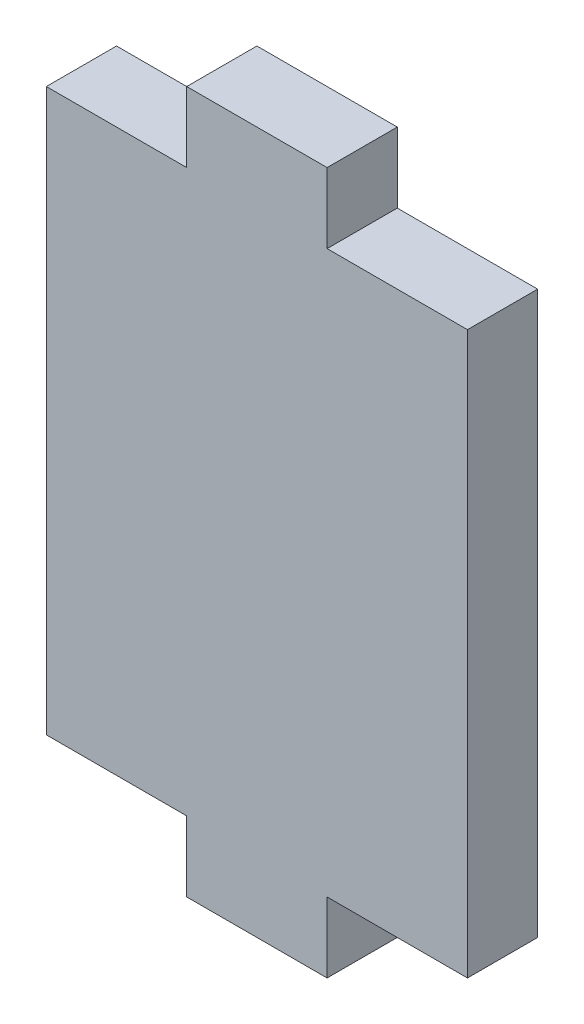
ISO-10303-21;
HEADER;
FILE_DESCRIPTION(('STEP AP214'),'2;1');
FILE_NAME('part.step','',(''),(''),'','','');
FILE_SCHEMA(('AUTOMOTIVE_DESIGN { 1 0 10303 214 1 1 1 1 }'));
ENDSEC;
DATA;
#1=APPLICATION_CONTEXT('core data for automotive mechanical design processes');
#2=APPLICATION_PROTOCOL_DEFINITION('international standard','automotive_design',2000,#1);
#3=PRODUCT_CONTEXT('',#1,'mechanical');
#4=PRODUCT('Part','Part','',(#3));
#5=PRODUCT_RELATED_PRODUCT_CATEGORY('part','',(#4));
#6=PRODUCT_DEFINITION_FORMATION('','',#4);
#7=PRODUCT_DEFINITION_CONTEXT('part definition',#1,'design');
#8=PRODUCT_DEFINITION('design','',#6,#7);
#9=PRODUCT_DEFINITION_SHAPE('','',#8);
#10=(LENGTH_UNIT() NAMED_UNIT(*) SI_UNIT(.MILLI.,.METRE.));
#11=(NAMED_UNIT(*) PLANE_ANGLE_UNIT() SI_UNIT($,.RADIAN.));
#12=(NAMED_UNIT(*) SI_UNIT($,.STERADIAN.) SOLID_ANGLE_UNIT());
#13=UNCERTAINTY_MEASURE_WITH_UNIT(LENGTH_MEASURE(1.E-05),#10,'distance_accuracy_value','');
#14=(GEOMETRIC_REPRESENTATION_CONTEXT(3) GLOBAL_UNCERTAINTY_ASSIGNED_CONTEXT((#13)) GLOBAL_UNIT_ASSIGNED_CONTEXT((#10,
#11,#12)) REPRESENTATION_CONTEXT('',''));
#15=CARTESIAN_POINT('',(0.,0.,0.));
#16=DIRECTION('',(0.,0.,1.));
#17=DIRECTION('',(1.,0.,0.));
#18=AXIS2_PLACEMENT_3D('',#15,#16,#17);
#19=CARTESIAN_POINT('',(-15.,-20.,5.));
#20=DIRECTION('',(-1.,0.,0.));
#21=DIRECTION('',(0.,0.,1.));
#22=AXIS2_PLACEMENT_3D('',#19,#20,#21);
#23=PLANE('',#22);
#24=DIRECTION('',(0.,1.,0.));
#25=VECTOR('',#24,1.);
#26=CARTESIAN_POINT('',(-15.,-20.,0.));
#27=LINE('',#26,#25);
#28=CARTESIAN_POINT('',(-15.,-20.,0.));
#29=VERTEX_POINT('',#28);
#30=CARTESIAN_POINT('',(-15.,20.,0.));
#31=VERTEX_POINT('',#30);
#32=EDGE_CURVE('E160',#29,#31,#27,.T.);
#33=ORIENTED_EDGE('',*,*,#32,.F.);
#34=DIRECTION('',(0.,0.,-1.));
#35=VECTOR('',#34,1.);
#36=CARTESIAN_POINT('',(-15.,-20.,5.));
#37=LINE('',#36,#35);
#38=CARTESIAN_POINT('',(-15.,-20.,5.));
#39=VERTEX_POINT('',#38);
#40=EDGE_CURVE('E11',#39,#29,#37,.T.);
#41=ORIENTED_EDGE('',*,*,#40,.F.);
#42=DIRECTION('',(0.,1.,0.));
#43=VECTOR('',#42,1.);
#44=CARTESIAN_POINT('',(-15.,-20.,5.));
#45=LINE('',#44,#43);
#46=CARTESIAN_POINT('',(-15.,20.,5.));
#47=VERTEX_POINT('',#46);
#48=EDGE_CURVE('E189',#39,#47,#45,.T.);
#49=ORIENTED_EDGE('',*,*,#48,.T.);
#50=DIRECTION('',(0.,0.,-1.));
#51=VECTOR('',#50,1.);
#52=CARTESIAN_POINT('',(-15.,20.,5.));
#53=LINE('',#52,#51);
#54=EDGE_CURVE('E40',#47,#31,#53,.T.);
#55=ORIENTED_EDGE('',*,*,#54,.T.);
#56=EDGE_LOOP('',(#33,#41,#49,#55));
#57=FACE_BOUND('',#56,.T.);
#58=ADVANCED_FACE('F37',(#57),#23,.T.);
#59=CARTESIAN_POINT('',(-15.,-20.,5.));
#60=DIRECTION('',(0.,1.,0.));
#61=DIRECTION('',(-1.,0.,0.));
#62=AXIS2_PLACEMENT_3D('',#59,#60,#61);
#63=PLANE('',#62);
#64=DIRECTION('',(1.,0.,0.));
#65=VECTOR('',#64,1.);
#66=CARTESIAN_POINT('',(-15.,-20.,0.));
#67=LINE('',#66,#65);
#68=CARTESIAN_POINT('',(-5.,-20.,0.));
#69=VERTEX_POINT('',#68);
#70=EDGE_CURVE('E94',#29,#69,#67,.T.);
#71=ORIENTED_EDGE('',*,*,#70,.T.);
#72=DIRECTION('',(0.,0.,-1.));
#73=VECTOR('',#72,1.);
#74=CARTESIAN_POINT('',(-5.,-20.,5.));
#75=LINE('',#74,#73);
#76=CARTESIAN_POINT('',(-5.,-20.,5.));
#77=VERTEX_POINT('',#76);
#78=EDGE_CURVE('E46',#77,#69,#75,.T.);
#79=ORIENTED_EDGE('',*,*,#78,.F.);
#80=DIRECTION('',(1.,0.,0.));
#81=VECTOR('',#80,1.);
#82=CARTESIAN_POINT('',(-15.,-20.,5.));
#83=LINE('',#82,#81);
#84=EDGE_CURVE('E138',#39,#77,#83,.T.);
#85=ORIENTED_EDGE('',*,*,#84,.F.);
#86=ORIENTED_EDGE('',*,*,#40,.T.);
#87=EDGE_LOOP('',(#71,#79,#85,#86));
#88=FACE_BOUND('',#87,.T.);
#89=ADVANCED_FACE('F264',(#88),#63,.F.);
#90=CARTESIAN_POINT('',(-5.,-20.,5.));
#91=DIRECTION('',(1.,0.,0.));
#92=DIRECTION('',(0.,1.,0.));
#93=AXIS2_PLACEMENT_3D('',#90,#91,#92);
#94=PLANE('',#93);
#95=DIRECTION('',(0.,-1.,0.));
#96=VECTOR('',#95,1.);
#97=CARTESIAN_POINT('',(-5.,-20.,0.));
#98=LINE('',#97,#96);
#99=CARTESIAN_POINT('',(-5.,-25.,0.));
#100=VERTEX_POINT('',#99);
#101=EDGE_CURVE('E145',#69,#100,#98,.T.);
#102=ORIENTED_EDGE('',*,*,#101,.T.);
#103=DIRECTION('',(0.,0.,-1.));
#104=VECTOR('',#103,1.);
#105=CARTESIAN_POINT('',(-5.,-25.,5.));
#106=LINE('',#105,#104);
#107=CARTESIAN_POINT('',(-5.,-25.,5.));
#108=VERTEX_POINT('',#107);
#109=EDGE_CURVE('E142',#108,#100,#106,.T.);
#110=ORIENTED_EDGE('',*,*,#109,.F.);
#111=DIRECTION('',(0.,-1.,0.));
#112=VECTOR('',#111,1.);
#113=CARTESIAN_POINT('',(-5.,-20.,5.));
#114=LINE('',#113,#112);
#115=EDGE_CURVE('E130',#77,#108,#114,.T.);
#116=ORIENTED_EDGE('',*,*,#115,.F.);
#117=ORIENTED_EDGE('',*,*,#78,.T.);
#118=EDGE_LOOP('',(#102,#110,#116,#117));
#119=FACE_BOUND('',#118,.T.);
#120=ADVANCED_FACE('F143',(#119),#94,.F.);
#121=CARTESIAN_POINT('',(-5.,-25.,5.));
#122=DIRECTION('',(0.,1.,0.));
#123=DIRECTION('',(0.,0.,1.));
#124=AXIS2_PLACEMENT_3D('',#121,#122,#123);
#125=PLANE('',#124);
#126=DIRECTION('',(1.,0.,0.));
#127=VECTOR('',#126,1.);
#128=CARTESIAN_POINT('',(-5.,-25.,0.));
#129=LINE('',#128,#127);
#130=CARTESIAN_POINT('',(5.,-25.,0.));
#131=VERTEX_POINT('',#130);
#132=EDGE_CURVE('E186',#100,#131,#129,.T.);
#133=ORIENTED_EDGE('',*,*,#132,.T.);
#134=DIRECTION('',(0.,0.,-1.));
#135=VECTOR('',#134,1.);
#136=CARTESIAN_POINT('',(5.,-25.,5.));
#137=LINE('',#136,#135);
#138=CARTESIAN_POINT('',(5.,-25.,5.));
#139=VERTEX_POINT('',#138);
#140=EDGE_CURVE('E149',#139,#131,#137,.T.);
#141=ORIENTED_EDGE('',*,*,#140,.F.);
#142=DIRECTION('',(1.,0.,0.));
#143=VECTOR('',#142,1.);
#144=CARTESIAN_POINT('',(-5.,-25.,5.));
#145=LINE('',#144,#143);
#146=EDGE_CURVE('E136',#108,#139,#145,.T.);
#147=ORIENTED_EDGE('',*,*,#146,.F.);
#148=ORIENTED_EDGE('',*,*,#109,.T.);
#149=EDGE_LOOP('',(#133,#141,#147,#148));
#150=FACE_BOUND('',#149,.T.);
#151=ADVANCED_FACE('F151',(#150),#125,.F.);
#152=CARTESIAN_POINT('',(5.,-20.,5.));
#153=DIRECTION('',(1.,0.,0.));
#154=DIRECTION('',(0.,1.,0.));
#155=AXIS2_PLACEMENT_3D('',#152,#153,#154);
#156=PLANE('',#155);
#157=DIRECTION('',(0.,-1.,0.));
#158=VECTOR('',#157,1.);
#159=CARTESIAN_POINT('',(5.,-20.,0.));
#160=LINE('',#159,#158);
#161=CARTESIAN_POINT('',(5.,-20.,0.));
#162=VERTEX_POINT('',#161);
#163=EDGE_CURVE('E183',#162,#131,#160,.T.);
#164=ORIENTED_EDGE('',*,*,#163,.F.);
#165=DIRECTION('',(0.,0.,-1.));
#166=VECTOR('',#165,1.);
#167=CARTESIAN_POINT('',(5.,-20.,5.));
#168=LINE('',#167,#166);
#169=CARTESIAN_POINT('',(5.,-20.,5.));
#170=VERTEX_POINT('',#169);
#171=EDGE_CURVE('E193',#170,#162,#168,.T.);
#172=ORIENTED_EDGE('',*,*,#171,.F.);
#173=DIRECTION('',(0.,-1.,0.));
#174=VECTOR('',#173,1.);
#175=CARTESIAN_POINT('',(5.,-20.,5.));
#176=LINE('',#175,#174);
#177=EDGE_CURVE('E153',#170,#139,#176,.T.);
#178=ORIENTED_EDGE('',*,*,#177,.T.);
#179=ORIENTED_EDGE('',*,*,#140,.T.);
#180=EDGE_LOOP('',(#164,#172,#178,#179));
#181=FACE_BOUND('',#180,.T.);
#182=ADVANCED_FACE('F214',(#181),#156,.T.);
#183=CARTESIAN_POINT('',(5.,-20.,5.));
#184=DIRECTION('',(0.,1.,0.));
#185=DIRECTION('',(-1.,0.,0.));
#186=AXIS2_PLACEMENT_3D('',#183,#184,#185);
#187=PLANE('',#186);
#188=DIRECTION('',(1.,0.,0.));
#189=VECTOR('',#188,1.);
#190=CARTESIAN_POINT('',(5.,-20.,0.));
#191=LINE('',#190,#189);
#192=CARTESIAN_POINT('',(15.,-20.,0.));
#193=VERTEX_POINT('',#192);
#194=EDGE_CURVE('E181',#162,#193,#191,.T.);
#195=ORIENTED_EDGE('',*,*,#194,.T.);
#196=DIRECTION('',(0.,0.,-1.));
#197=VECTOR('',#196,1.);
#198=CARTESIAN_POINT('',(15.,-20.,5.));
#199=LINE('',#198,#197);
#200=CARTESIAN_POINT('',(15.,-20.,5.));
#201=VERTEX_POINT('',#200);
#202=EDGE_CURVE('E195',#201,#193,#199,.T.);
#203=ORIENTED_EDGE('',*,*,#202,.F.);
#204=DIRECTION('',(1.,0.,0.));
#205=VECTOR('',#204,1.);
#206=CARTESIAN_POINT('',(5.,-20.,5.));
#207=LINE('',#206,#205);
#208=EDGE_CURVE('E155',#170,#201,#207,.T.);
#209=ORIENTED_EDGE('',*,*,#208,.F.);
#210=ORIENTED_EDGE('',*,*,#171,.T.);
#211=EDGE_LOOP('',(#195,#203,#209,#210));
#212=FACE_BOUND('',#211,.T.);
#213=ADVANCED_FACE('F222',(#212),#187,.F.);
#214=CARTESIAN_POINT('',(15.,-20.,5.));
#215=DIRECTION('',(-1.,0.,0.));
#216=DIRECTION('',(0.,0.,1.));
#217=AXIS2_PLACEMENT_3D('',#214,#215,#216);
#218=PLANE('',#217);
#219=DIRECTION('',(0.,1.,0.));
#220=VECTOR('',#219,1.);
#221=CARTESIAN_POINT('',(15.,-20.,0.));
#222=LINE('',#221,#220);
#223=CARTESIAN_POINT('',(15.,20.,0.));
#224=VERTEX_POINT('',#223);
#225=EDGE_CURVE('E178',#193,#224,#222,.T.);
#226=ORIENTED_EDGE('',*,*,#225,.T.);
#227=DIRECTION('',(0.,0.,-1.));
#228=VECTOR('',#227,1.);
#229=CARTESIAN_POINT('',(15.,20.,5.));
#230=LINE('',#229,#228);
#231=CARTESIAN_POINT('',(15.,20.,5.));
#232=VERTEX_POINT('',#231);
#233=EDGE_CURVE('E198',#232,#224,#230,.T.);
#234=ORIENTED_EDGE('',*,*,#233,.F.);
#235=DIRECTION('',(0.,1.,0.));
#236=VECTOR('',#235,1.);
#237=CARTESIAN_POINT('',(15.,-20.,5.));
#238=LINE('',#237,#236);
#239=EDGE_CURVE('E219',#201,#232,#238,.T.);
#240=ORIENTED_EDGE('',*,*,#239,.F.);
#241=ORIENTED_EDGE('',*,*,#202,.T.);
#242=EDGE_LOOP('',(#226,#234,#240,#241));
#243=FACE_BOUND('',#242,.T.);
#244=ADVANCED_FACE('F224',(#243),#218,.F.);
#245=CARTESIAN_POINT('',(5.,20.,5.));
#246=DIRECTION('',(0.,1.,0.));
#247=DIRECTION('',(-1.,0.,0.));
#248=AXIS2_PLACEMENT_3D('',#245,#246,#247);
#249=PLANE('',#248);
#250=DIRECTION('',(1.,0.,0.));
#251=VECTOR('',#250,1.);
#252=CARTESIAN_POINT('',(5.,20.,0.));
#253=LINE('',#252,#251);
#254=CARTESIAN_POINT('',(5.,20.,0.));
#255=VERTEX_POINT('',#254);
#256=EDGE_CURVE('E175',#255,#224,#253,.T.);
#257=ORIENTED_EDGE('',*,*,#256,.F.);
#258=DIRECTION('',(0.,0.,-1.));
#259=VECTOR('',#258,1.);
#260=CARTESIAN_POINT('',(5.,20.,5.));
#261=LINE('',#260,#259);
#262=CARTESIAN_POINT('',(5.,20.,5.));
#263=VERTEX_POINT('',#262);
#264=EDGE_CURVE('E200',#263,#255,#261,.T.);
#265=ORIENTED_EDGE('',*,*,#264,.F.);
#266=DIRECTION('',(1.,0.,0.));
#267=VECTOR('',#266,1.);
#268=CARTESIAN_POINT('',(5.,20.,5.));
#269=LINE('',#268,#267);
#270=EDGE_CURVE('E226',#263,#232,#269,.T.);
#271=ORIENTED_EDGE('',*,*,#270,.T.);
#272=ORIENTED_EDGE('',*,*,#233,.T.);
#273=EDGE_LOOP('',(#257,#265,#271,#272));
#274=FACE_BOUND('',#273,.T.);
#275=ADVANCED_FACE('F254',(#274),#249,.T.);
#276=CARTESIAN_POINT('',(5.,20.,5.));
#277=DIRECTION('',(-1.,0.,0.));
#278=DIRECTION('',(0.,-1.,0.));
#279=AXIS2_PLACEMENT_3D('',#276,#277,#278);
#280=PLANE('',#279);
#281=DIRECTION('',(0.,1.,0.));
#282=VECTOR('',#281,1.);
#283=CARTESIAN_POINT('',(5.,20.,0.));
#284=LINE('',#283,#282);
#285=CARTESIAN_POINT('',(5.,25.,0.));
#286=VERTEX_POINT('',#285);
#287=EDGE_CURVE('E172',#255,#286,#284,.T.);
#288=ORIENTED_EDGE('',*,*,#287,.T.);
#289=DIRECTION('',(0.,0.,-1.));
#290=VECTOR('',#289,1.);
#291=CARTESIAN_POINT('',(5.,25.,5.));
#292=LINE('',#291,#290);
#293=CARTESIAN_POINT('',(5.,25.,5.));
#294=VERTEX_POINT('',#293);
#295=EDGE_CURVE('E202',#294,#286,#292,.T.);
#296=ORIENTED_EDGE('',*,*,#295,.F.);
#297=DIRECTION('',(0.,1.,0.));
#298=VECTOR('',#297,1.);
#299=CARTESIAN_POINT('',(5.,20.,5.));
#300=LINE('',#299,#298);
#301=EDGE_CURVE('E228',#263,#294,#300,.T.);
#302=ORIENTED_EDGE('',*,*,#301,.F.);
#303=ORIENTED_EDGE('',*,*,#264,.T.);
#304=EDGE_LOOP('',(#288,#296,#302,#303));
#305=FACE_BOUND('',#304,.T.);
#306=ADVANCED_FACE('F252',(#305),#280,.F.);
#307=CARTESIAN_POINT('',(-5.,25.,5.));
#308=DIRECTION('',(0.,1.,0.));
#309=DIRECTION('',(0.,0.,1.));
#310=AXIS2_PLACEMENT_3D('',#307,#308,#309);
#311=PLANE('',#310);
#312=DIRECTION('',(1.,0.,0.));
#313=VECTOR('',#312,1.);
#314=CARTESIAN_POINT('',(-5.,25.,0.));
#315=LINE('',#314,#313);
#316=CARTESIAN_POINT('',(-5.,25.,0.));
#317=VERTEX_POINT('',#316);
#318=EDGE_CURVE('E169',#317,#286,#315,.T.);
#319=ORIENTED_EDGE('',*,*,#318,.F.);
#320=DIRECTION('',(0.,0.,-1.));
#321=VECTOR('',#320,1.);
#322=CARTESIAN_POINT('',(-5.,25.,5.));
#323=LINE('',#322,#321);
#324=CARTESIAN_POINT('',(-5.,25.,5.));
#325=VERTEX_POINT('',#324);
#326=EDGE_CURVE('E204',#325,#317,#323,.T.);
#327=ORIENTED_EDGE('',*,*,#326,.F.);
#328=DIRECTION('',(1.,0.,0.));
#329=VECTOR('',#328,1.);
#330=CARTESIAN_POINT('',(-5.,25.,5.));
#331=LINE('',#330,#329);
#332=EDGE_CURVE('E232',#325,#294,#331,.T.);
#333=ORIENTED_EDGE('',*,*,#332,.T.);
#334=ORIENTED_EDGE('',*,*,#295,.T.);
#335=EDGE_LOOP('',(#319,#327,#333,#334));
#336=FACE_BOUND('',#335,.T.);
#337=ADVANCED_FACE('F248',(#336),#311,.T.);
#338=CARTESIAN_POINT('',(-5.,20.,5.));
#339=DIRECTION('',(-1.,0.,0.));
#340=DIRECTION('',(0.,0.,1.));
#341=AXIS2_PLACEMENT_3D('',#338,#339,#340);
#342=PLANE('',#341);
#343=DIRECTION('',(0.,1.,0.));
#344=VECTOR('',#343,1.);
#345=CARTESIAN_POINT('',(-5.,20.,0.));
#346=LINE('',#345,#344);
#347=CARTESIAN_POINT('',(-5.,20.,0.));
#348=VERTEX_POINT('',#347);
#349=EDGE_CURVE('E166',#348,#317,#346,.T.);
#350=ORIENTED_EDGE('',*,*,#349,.F.);
#351=DIRECTION('',(0.,0.,-1.));
#352=VECTOR('',#351,1.);
#353=CARTESIAN_POINT('',(-5.,20.,5.));
#354=LINE('',#353,#352);
#355=CARTESIAN_POINT('',(-5.,20.,5.));
#356=VERTEX_POINT('',#355);
#357=EDGE_CURVE('E205',#356,#348,#354,.T.);
#358=ORIENTED_EDGE('',*,*,#357,.F.);
#359=DIRECTION('',(0.,1.,0.));
#360=VECTOR('',#359,1.);
#361=CARTESIAN_POINT('',(-5.,20.,5.));
#362=LINE('',#361,#360);
#363=EDGE_CURVE('E235',#356,#325,#362,.T.);
#364=ORIENTED_EDGE('',*,*,#363,.T.);
#365=ORIENTED_EDGE('',*,*,#326,.T.);
#366=EDGE_LOOP('',(#350,#358,#364,#365));
#367=FACE_BOUND('',#366,.T.);
#368=ADVANCED_FACE('F243',(#367),#342,.T.);
#369=CARTESIAN_POINT('',(-15.,20.,5.));
#370=DIRECTION('',(0.,1.,0.));
#371=DIRECTION('',(-1.,0.,0.));
#372=AXIS2_PLACEMENT_3D('',#369,#370,#371);
#373=PLANE('',#372);
#374=DIRECTION('',(1.,0.,0.));
#375=VECTOR('',#374,1.);
#376=CARTESIAN_POINT('',(-15.,20.,0.));
#377=LINE('',#376,#375);
#378=EDGE_CURVE('E163',#31,#348,#377,.T.);
#379=ORIENTED_EDGE('',*,*,#378,.F.);
#380=ORIENTED_EDGE('',*,*,#54,.F.);
#381=DIRECTION('',(1.,0.,0.));
#382=VECTOR('',#381,1.);
#383=CARTESIAN_POINT('',(-15.,20.,5.));
#384=LINE('',#383,#382);
#385=EDGE_CURVE('E238',#47,#356,#384,.T.);
#386=ORIENTED_EDGE('',*,*,#385,.T.);
#387=ORIENTED_EDGE('',*,*,#357,.T.);
#388=EDGE_LOOP('',(#379,#380,#386,#387));
#389=FACE_BOUND('',#388,.T.);
#390=ADVANCED_FACE('F207',(#389),#373,.T.);
#391=CARTESIAN_POINT('',(0.,0.,5.));
#392=DIRECTION('',(0.,0.,-1.));
#393=DIRECTION('',(-1.,0.,0.));
#394=AXIS2_PLACEMENT_3D('',#391,#392,#393);
#395=PLANE('',#394);
#396=ORIENTED_EDGE('',*,*,#48,.F.);
#397=ORIENTED_EDGE('',*,*,#84,.T.);
#398=ORIENTED_EDGE('',*,*,#115,.T.);
#399=ORIENTED_EDGE('',*,*,#146,.T.);
#400=ORIENTED_EDGE('',*,*,#177,.F.);
#401=ORIENTED_EDGE('',*,*,#208,.T.);
#402=ORIENTED_EDGE('',*,*,#239,.T.);
#403=ORIENTED_EDGE('',*,*,#270,.F.);
#404=ORIENTED_EDGE('',*,*,#301,.T.);
#405=ORIENTED_EDGE('',*,*,#332,.F.);
#406=ORIENTED_EDGE('',*,*,#363,.F.);
#407=ORIENTED_EDGE('',*,*,#385,.F.);
#408=EDGE_LOOP('',(#396,#397,#398,#399,#400,#401,#402,#403,#404,#405,#406,#407));
#409=FACE_BOUND('',#408,.T.);
#410=ADVANCED_FACE('F133',(#409),#395,.F.);
#411=CARTESIAN_POINT('',(0.,0.,0.));
#412=DIRECTION('',(0.,0.,-1.));
#413=DIRECTION('',(-1.,0.,0.));
#414=AXIS2_PLACEMENT_3D('',#411,#412,#413);
#415=PLANE('',#414);
#416=ORIENTED_EDGE('',*,*,#32,.T.);
#417=ORIENTED_EDGE('',*,*,#378,.T.);
#418=ORIENTED_EDGE('',*,*,#349,.T.);
#419=ORIENTED_EDGE('',*,*,#318,.T.);
#420=ORIENTED_EDGE('',*,*,#287,.F.);
#421=ORIENTED_EDGE('',*,*,#256,.T.);
#422=ORIENTED_EDGE('',*,*,#225,.F.);
#423=ORIENTED_EDGE('',*,*,#194,.F.);
#424=ORIENTED_EDGE('',*,*,#163,.T.);
#425=ORIENTED_EDGE('',*,*,#132,.F.);
#426=ORIENTED_EDGE('',*,*,#101,.F.);
#427=ORIENTED_EDGE('',*,*,#70,.F.);
#428=EDGE_LOOP('',(#416,#417,#418,#419,#420,#421,#422,#423,#424,#425,#426,#427));
#429=FACE_BOUND('',#428,.T.);
#430=ADVANCED_FACE('F209',(#429),#415,.T.);
#431=CLOSED_SHELL('',(#58,#89,#120,#151,#182,#213,#244,#275,#306,#337,#368,#390,#410,#430));
#432=MANIFOLD_SOLID_BREP('B2',#431);
#433=ADVANCED_BREP_SHAPE_REPRESENTATION('',(#18,#432),#14);
#434=SHAPE_DEFINITION_REPRESENTATION(#9,#433);
ENDSEC;
END-ISO-10303-21;
